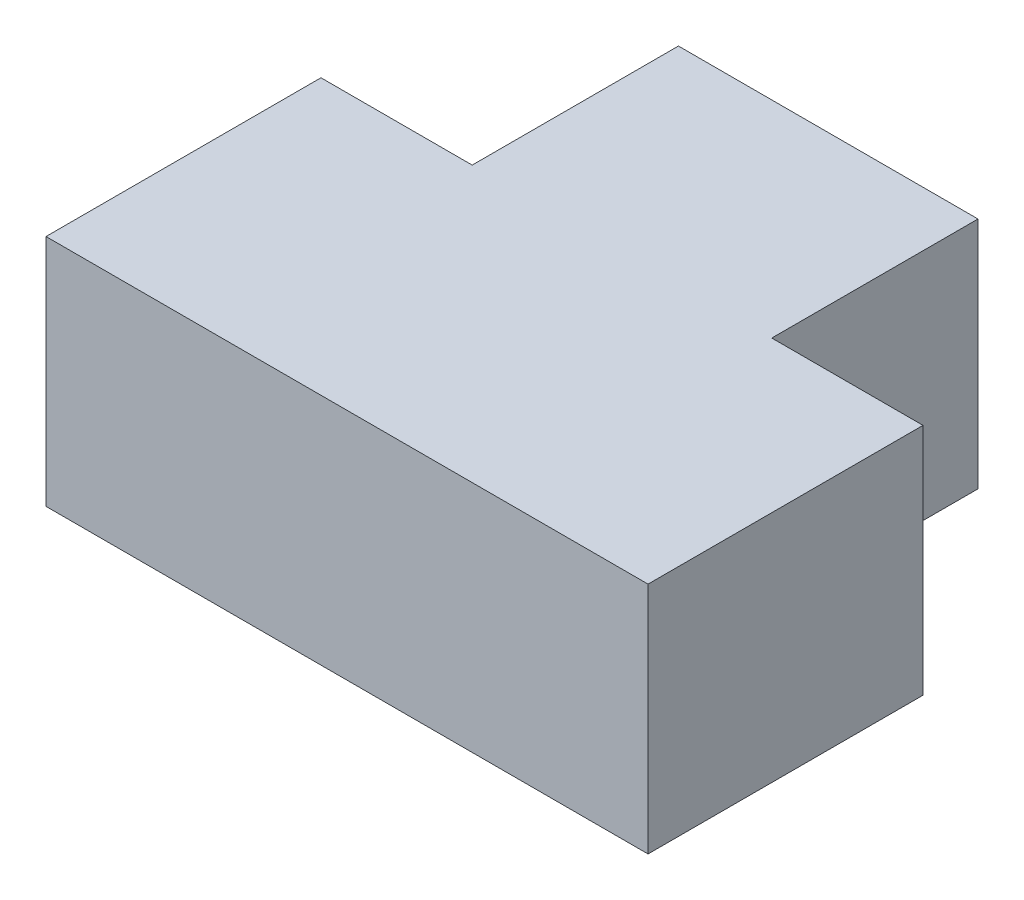
ISO-10303-21;
HEADER;
FILE_DESCRIPTION(('STEP AP214'),'2;1');
FILE_NAME('part.step','',(''),(''),'','','');
FILE_SCHEMA(('AUTOMOTIVE_DESIGN { 1 0 10303 214 1 1 1 1 }'));
ENDSEC;
DATA;
#1=APPLICATION_CONTEXT('core data for automotive mechanical design processes');
#2=APPLICATION_PROTOCOL_DEFINITION('international standard','automotive_design',2000,#1);
#3=PRODUCT_CONTEXT('',#1,'mechanical');
#4=PRODUCT('Part','Part','',(#3));
#5=PRODUCT_RELATED_PRODUCT_CATEGORY('part','',(#4));
#6=PRODUCT_DEFINITION_FORMATION('','',#4);
#7=PRODUCT_DEFINITION_CONTEXT('part definition',#1,'design');
#8=PRODUCT_DEFINITION('design','',#6,#7);
#9=PRODUCT_DEFINITION_SHAPE('','',#8);
#10=(LENGTH_UNIT() NAMED_UNIT(*) SI_UNIT(.MILLI.,.METRE.));
#11=(NAMED_UNIT(*) PLANE_ANGLE_UNIT() SI_UNIT($,.RADIAN.));
#12=(NAMED_UNIT(*) SI_UNIT($,.STERADIAN.) SOLID_ANGLE_UNIT());
#13=UNCERTAINTY_MEASURE_WITH_UNIT(LENGTH_MEASURE(1.E-05),#10,'distance_accuracy_value','');
#14=(GEOMETRIC_REPRESENTATION_CONTEXT(3) GLOBAL_UNCERTAINTY_ASSIGNED_CONTEXT((#13)) GLOBAL_UNIT_ASSIGNED_CONTEXT((#10,
#11,#12)) REPRESENTATION_CONTEXT('',''));
#15=CARTESIAN_POINT('',(0.,0.,0.));
#16=DIRECTION('',(0.,0.,1.));
#17=DIRECTION('',(1.,0.,0.));
#18=AXIS2_PLACEMENT_3D('',#15,#16,#17);
#19=CARTESIAN_POINT('',(0.,0.,0.));
#20=DIRECTION('',(0.,1.,0.));
#21=DIRECTION('',(0.,0.,1.));
#22=AXIS2_PLACEMENT_3D('',#19,#20,#21);
#23=PLANE('',#22);
#24=DIRECTION('',(0.,0.,1.));
#25=VECTOR('',#24,1.);
#26=CARTESIAN_POINT('',(2.1790442102432,0.,0.));
#27=LINE('',#26,#25);
#28=CARTESIAN_POINT('',(2.1790442102432,0.,-3.));
#29=VERTEX_POINT('',#28);
#30=CARTESIAN_POINT('',(2.1790442102432,0.,0.));
#31=VERTEX_POINT('',#30);
#32=EDGE_CURVE('E107',#29,#31,#27,.T.);
#33=ORIENTED_EDGE('',*,*,#32,.T.);
#34=DIRECTION('',(-1.,0.,0.));
#35=VECTOR('',#34,1.);
#36=CARTESIAN_POINT('',(4.3790442102432,0.,0.));
#37=LINE('',#36,#35);
#38=CARTESIAN_POINT('',(4.3790442102432,0.,0.));
#39=VERTEX_POINT('',#38);
#40=EDGE_CURVE('E153',#39,#31,#37,.T.);
#41=ORIENTED_EDGE('',*,*,#40,.F.);
#42=DIRECTION('',(0.,0.,-1.));
#43=VECTOR('',#42,1.);
#44=CARTESIAN_POINT('',(4.3790442102432,0.,4.));
#45=LINE('',#44,#43);
#46=CARTESIAN_POINT('',(4.3790442102432,0.,4.));
#47=VERTEX_POINT('',#46);
#48=EDGE_CURVE('E150',#47,#39,#45,.T.);
#49=ORIENTED_EDGE('',*,*,#48,.F.);
#50=DIRECTION('',(1.,0.,0.));
#51=VECTOR('',#50,1.);
#52=CARTESIAN_POINT('',(2.3790442102432,0.,4.));
#53=LINE('',#52,#51);
#54=CARTESIAN_POINT('',(-4.3790442102432,0.,4.));
#55=VERTEX_POINT('',#54);
#56=EDGE_CURVE('E147',#55,#47,#53,.T.);
#57=ORIENTED_EDGE('',*,*,#56,.F.);
#58=DIRECTION('',(0.,0.,1.));
#59=VECTOR('',#58,1.);
#60=CARTESIAN_POINT('',(-4.3790442102432,0.,4.));
#61=LINE('',#60,#59);
#62=CARTESIAN_POINT('',(-4.3790442102432,0.,0.));
#63=VERTEX_POINT('',#62);
#64=EDGE_CURVE('E144',#63,#55,#61,.T.);
#65=ORIENTED_EDGE('',*,*,#64,.F.);
#66=DIRECTION('',(-1.,0.,0.));
#67=VECTOR('',#66,1.);
#68=CARTESIAN_POINT('',(-4.3790442102432,0.,0.));
#69=LINE('',#68,#67);
#70=CARTESIAN_POINT('',(-2.1790442102432,0.,0.));
#71=VERTEX_POINT('',#70);
#72=EDGE_CURVE('E142',#71,#63,#69,.T.);
#73=ORIENTED_EDGE('',*,*,#72,.F.);
#74=DIRECTION('',(0.,0.,-1.));
#75=VECTOR('',#74,1.);
#76=CARTESIAN_POINT('',(-2.1790442102432,0.,0.));
#77=LINE('',#76,#75);
#78=CARTESIAN_POINT('',(-2.1790442102432,0.,-3.));
#79=VERTEX_POINT('',#78);
#80=EDGE_CURVE('E127',#71,#79,#77,.T.);
#81=ORIENTED_EDGE('',*,*,#80,.T.);
#82=DIRECTION('',(-1.,0.,0.));
#83=VECTOR('',#82,1.);
#84=CARTESIAN_POINT('',(2.3790442102432,0.,-3.));
#85=LINE('',#84,#83);
#86=EDGE_CURVE('E111',#29,#79,#85,.T.);
#87=ORIENTED_EDGE('',*,*,#86,.F.);
#88=EDGE_LOOP('',(#33,#41,#49,#57,#65,#73,#81,#87));
#89=FACE_BOUND('',#88,.T.);
#90=ADVANCED_FACE('F35',(#89),#23,.F.);
#91=CARTESIAN_POINT('',(2.3790442102432,14.6117845493506,-3.));
#92=DIRECTION('',(0.,0.,1.));
#93=DIRECTION('',(1.,0.,0.));
#94=AXIS2_PLACEMENT_3D('',#91,#92,#93);
#95=PLANE('',#94);
#96=DIRECTION('',(0.,-1.,0.));
#97=VECTOR('',#96,1.);
#98=CARTESIAN_POINT('',(2.1790442102432,3.4,-3.));
#99=LINE('',#98,#97);
#100=CARTESIAN_POINT('',(2.1790442102432,3.4,-3.));
#101=VERTEX_POINT('',#100);
#102=EDGE_CURVE('E102',#101,#29,#99,.T.);
#103=ORIENTED_EDGE('',*,*,#102,.T.);
#104=ORIENTED_EDGE('',*,*,#86,.T.);
#105=DIRECTION('',(0.,-1.,0.));
#106=VECTOR('',#105,1.);
#107=CARTESIAN_POINT('',(-2.1790442102432,3.4,-3.));
#108=LINE('',#107,#106);
#109=CARTESIAN_POINT('',(-2.1790442102432,3.4,-3.));
#110=VERTEX_POINT('',#109);
#111=EDGE_CURVE('E119',#110,#79,#108,.T.);
#112=ORIENTED_EDGE('',*,*,#111,.F.);
#113=DIRECTION('',(1.,0.,0.));
#114=VECTOR('',#113,1.);
#115=CARTESIAN_POINT('',(2.3790442102432,3.4,-3.));
#116=LINE('',#115,#114);
#117=EDGE_CURVE('E11',#110,#101,#116,.T.);
#118=ORIENTED_EDGE('',*,*,#117,.T.);
#119=EDGE_LOOP('',(#103,#104,#112,#118));
#120=FACE_BOUND('',#119,.T.);
#121=ADVANCED_FACE('F37',(#120),#95,.F.);
#122=CARTESIAN_POINT('',(0.220955789756797,3.4,22.7));
#123=DIRECTION('',(0.,-1.,0.));
#124=DIRECTION('',(0.,0.,-1.));
#125=AXIS2_PLACEMENT_3D('',#122,#123,#124);
#126=PLANE('',#125);
#127=DIRECTION('',(0.,0.,1.));
#128=VECTOR('',#127,1.);
#129=CARTESIAN_POINT('',(2.1790442102432,3.4,0.));
#130=LINE('',#129,#128);
#131=CARTESIAN_POINT('',(2.1790442102432,3.4,0.));
#132=VERTEX_POINT('',#131);
#133=EDGE_CURVE('E105',#101,#132,#130,.T.);
#134=ORIENTED_EDGE('',*,*,#133,.F.);
#135=ORIENTED_EDGE('',*,*,#117,.F.);
#136=DIRECTION('',(0.,0.,-1.));
#137=VECTOR('',#136,1.);
#138=CARTESIAN_POINT('',(-2.1790442102432,3.4,0.));
#139=LINE('',#138,#137);
#140=CARTESIAN_POINT('',(-2.1790442102432,3.4,0.));
#141=VERTEX_POINT('',#140);
#142=EDGE_CURVE('E124',#141,#110,#139,.T.);
#143=ORIENTED_EDGE('',*,*,#142,.F.);
#144=DIRECTION('',(1.,0.,0.));
#145=VECTOR('',#144,1.);
#146=CARTESIAN_POINT('',(-4.3790442102432,3.4,0.));
#147=LINE('',#146,#145);
#148=CARTESIAN_POINT('',(-4.3790442102432,3.4,0.));
#149=VERTEX_POINT('',#148);
#150=EDGE_CURVE('E44',#149,#141,#147,.T.);
#151=ORIENTED_EDGE('',*,*,#150,.F.);
#152=DIRECTION('',(0.,0.,-1.));
#153=VECTOR('',#152,1.);
#154=CARTESIAN_POINT('',(-4.3790442102432,3.4,4.));
#155=LINE('',#154,#153);
#156=CARTESIAN_POINT('',(-4.3790442102432,3.4,4.));
#157=VERTEX_POINT('',#156);
#158=EDGE_CURVE('E137',#157,#149,#155,.T.);
#159=ORIENTED_EDGE('',*,*,#158,.F.);
#160=DIRECTION('',(-1.,0.,0.));
#161=VECTOR('',#160,1.);
#162=CARTESIAN_POINT('',(2.3790442102432,3.4,4.));
#163=LINE('',#162,#161);
#164=CARTESIAN_POINT('',(4.3790442102432,3.4,4.));
#165=VERTEX_POINT('',#164);
#166=EDGE_CURVE('E134',#165,#157,#163,.T.);
#167=ORIENTED_EDGE('',*,*,#166,.F.);
#168=DIRECTION('',(0.,0.,1.));
#169=VECTOR('',#168,1.);
#170=CARTESIAN_POINT('',(4.3790442102432,3.4,4.));
#171=LINE('',#170,#169);
#172=CARTESIAN_POINT('',(4.3790442102432,3.4,0.));
#173=VERTEX_POINT('',#172);
#174=EDGE_CURVE('E131',#173,#165,#171,.T.);
#175=ORIENTED_EDGE('',*,*,#174,.F.);
#176=DIRECTION('',(1.,0.,0.));
#177=VECTOR('',#176,1.);
#178=CARTESIAN_POINT('',(4.3790442102432,3.4,0.));
#179=LINE('',#178,#177);
#180=EDGE_CURVE('E39',#132,#173,#179,.T.);
#181=ORIENTED_EDGE('',*,*,#180,.F.);
#182=EDGE_LOOP('',(#134,#135,#143,#151,#159,#167,#175,#181));
#183=FACE_BOUND('',#182,.T.);
#184=ADVANCED_FACE('F115',(#183),#126,.F.);
#185=CARTESIAN_POINT('',(4.3790442102432,14.6117845493506,0.));
#186=DIRECTION('',(0.,0.,1.));
#187=DIRECTION('',(1.,0.,0.));
#188=AXIS2_PLACEMENT_3D('',#185,#186,#187);
#189=PLANE('',#188);
#190=ORIENTED_EDGE('',*,*,#180,.T.);
#191=DIRECTION('',(0.,-1.,0.));
#192=VECTOR('',#191,1.);
#193=CARTESIAN_POINT('',(4.3790442102432,14.6117845493506,0.));
#194=LINE('',#193,#192);
#195=EDGE_CURVE('E155',#173,#39,#194,.T.);
#196=ORIENTED_EDGE('',*,*,#195,.T.);
#197=ORIENTED_EDGE('',*,*,#40,.T.);
#198=DIRECTION('',(0.,-1.,0.));
#199=VECTOR('',#198,1.);
#200=CARTESIAN_POINT('',(2.1790442102432,3.4,0.));
#201=LINE('',#200,#199);
#202=EDGE_CURVE('E112',#132,#31,#201,.T.);
#203=ORIENTED_EDGE('',*,*,#202,.F.);
#204=EDGE_LOOP('',(#190,#196,#197,#203));
#205=FACE_BOUND('',#204,.T.);
#206=ADVANCED_FACE('F165',(#205),#189,.F.);
#207=CARTESIAN_POINT('',(4.3790442102432,14.6117845493506,4.));
#208=DIRECTION('',(-1.,0.,0.));
#209=DIRECTION('',(0.,0.,1.));
#210=AXIS2_PLACEMENT_3D('',#207,#208,#209);
#211=PLANE('',#210);
#212=ORIENTED_EDGE('',*,*,#195,.F.);
#213=ORIENTED_EDGE('',*,*,#174,.T.);
#214=DIRECTION('',(0.,-1.,0.));
#215=VECTOR('',#214,1.);
#216=CARTESIAN_POINT('',(4.3790442102432,14.6117845493506,4.));
#217=LINE('',#216,#215);
#218=EDGE_CURVE('E157',#165,#47,#217,.T.);
#219=ORIENTED_EDGE('',*,*,#218,.T.);
#220=ORIENTED_EDGE('',*,*,#48,.T.);
#221=EDGE_LOOP('',(#212,#213,#219,#220));
#222=FACE_BOUND('',#221,.T.);
#223=ADVANCED_FACE('F169',(#222),#211,.F.);
#224=CARTESIAN_POINT('',(2.3790442102432,14.6117845493506,4.));
#225=DIRECTION('',(0.,0.,-1.));
#226=DIRECTION('',(-1.,0.,0.));
#227=AXIS2_PLACEMENT_3D('',#224,#225,#226);
#228=PLANE('',#227);
#229=ORIENTED_EDGE('',*,*,#218,.F.);
#230=ORIENTED_EDGE('',*,*,#166,.T.);
#231=DIRECTION('',(0.,-1.,0.));
#232=VECTOR('',#231,1.);
#233=CARTESIAN_POINT('',(-4.3790442102432,14.6117845493506,4.));
#234=LINE('',#233,#232);
#235=EDGE_CURVE('E159',#157,#55,#234,.T.);
#236=ORIENTED_EDGE('',*,*,#235,.T.);
#237=ORIENTED_EDGE('',*,*,#56,.T.);
#238=EDGE_LOOP('',(#229,#230,#236,#237));
#239=FACE_BOUND('',#238,.T.);
#240=ADVANCED_FACE('F181',(#239),#228,.F.);
#241=CARTESIAN_POINT('',(-4.3790442102432,14.6117845493506,4.));
#242=DIRECTION('',(1.,0.,0.));
#243=DIRECTION('',(0.,0.,-1.));
#244=AXIS2_PLACEMENT_3D('',#241,#242,#243);
#245=PLANE('',#244);
#246=ORIENTED_EDGE('',*,*,#235,.F.);
#247=ORIENTED_EDGE('',*,*,#158,.T.);
#248=DIRECTION('',(0.,-1.,0.));
#249=VECTOR('',#248,1.);
#250=CARTESIAN_POINT('',(-4.3790442102432,14.6117845493506,0.));
#251=LINE('',#250,#249);
#252=EDGE_CURVE('E160',#149,#63,#251,.T.);
#253=ORIENTED_EDGE('',*,*,#252,.T.);
#254=ORIENTED_EDGE('',*,*,#64,.T.);
#255=EDGE_LOOP('',(#246,#247,#253,#254));
#256=FACE_BOUND('',#255,.T.);
#257=ADVANCED_FACE('F179',(#256),#245,.F.);
#258=CARTESIAN_POINT('',(-4.3790442102432,14.6117845493506,0.));
#259=DIRECTION('',(0.,0.,1.));
#260=DIRECTION('',(1.,0.,0.));
#261=AXIS2_PLACEMENT_3D('',#258,#259,#260);
#262=PLANE('',#261);
#263=ORIENTED_EDGE('',*,*,#72,.T.);
#264=ORIENTED_EDGE('',*,*,#252,.F.);
#265=ORIENTED_EDGE('',*,*,#150,.T.);
#266=DIRECTION('',(0.,-1.,0.));
#267=VECTOR('',#266,1.);
#268=CARTESIAN_POINT('',(-2.1790442102432,3.4,0.));
#269=LINE('',#268,#267);
#270=EDGE_CURVE('E123',#141,#71,#269,.T.);
#271=ORIENTED_EDGE('',*,*,#270,.T.);
#272=EDGE_LOOP('',(#263,#264,#265,#271));
#273=FACE_BOUND('',#272,.T.);
#274=ADVANCED_FACE('F177',(#273),#262,.F.);
#275=CARTESIAN_POINT('',(-2.1790442102432,3.4,0.));
#276=DIRECTION('',(-1.,0.,0.));
#277=DIRECTION('',(0.,0.,1.));
#278=AXIS2_PLACEMENT_3D('',#275,#276,#277);
#279=PLANE('',#278);
#280=ORIENTED_EDGE('',*,*,#80,.F.);
#281=ORIENTED_EDGE('',*,*,#270,.F.);
#282=ORIENTED_EDGE('',*,*,#142,.T.);
#283=ORIENTED_EDGE('',*,*,#111,.T.);
#284=EDGE_LOOP('',(#280,#281,#282,#283));
#285=FACE_BOUND('',#284,.T.);
#286=ADVANCED_FACE('F176',(#285),#279,.T.);
#287=CARTESIAN_POINT('',(2.1790442102432,3.4,0.));
#288=DIRECTION('',(1.,0.,0.));
#289=DIRECTION('',(0.,0.,-1.));
#290=AXIS2_PLACEMENT_3D('',#287,#288,#289);
#291=PLANE('',#290);
#292=ORIENTED_EDGE('',*,*,#32,.F.);
#293=ORIENTED_EDGE('',*,*,#102,.F.);
#294=ORIENTED_EDGE('',*,*,#133,.T.);
#295=ORIENTED_EDGE('',*,*,#202,.T.);
#296=EDGE_LOOP('',(#292,#293,#294,#295));
#297=FACE_BOUND('',#296,.T.);
#298=ADVANCED_FACE('F103',(#297),#291,.T.);
#299=CLOSED_SHELL('',(#90,#121,#184,#206,#223,#240,#257,#274,#286,#298));
#300=MANIFOLD_SOLID_BREP('B2',#299);
#301=ADVANCED_BREP_SHAPE_REPRESENTATION('',(#18,#300),#14);
#302=SHAPE_DEFINITION_REPRESENTATION(#9,#301);
ENDSEC;
END-ISO-10303-21;
